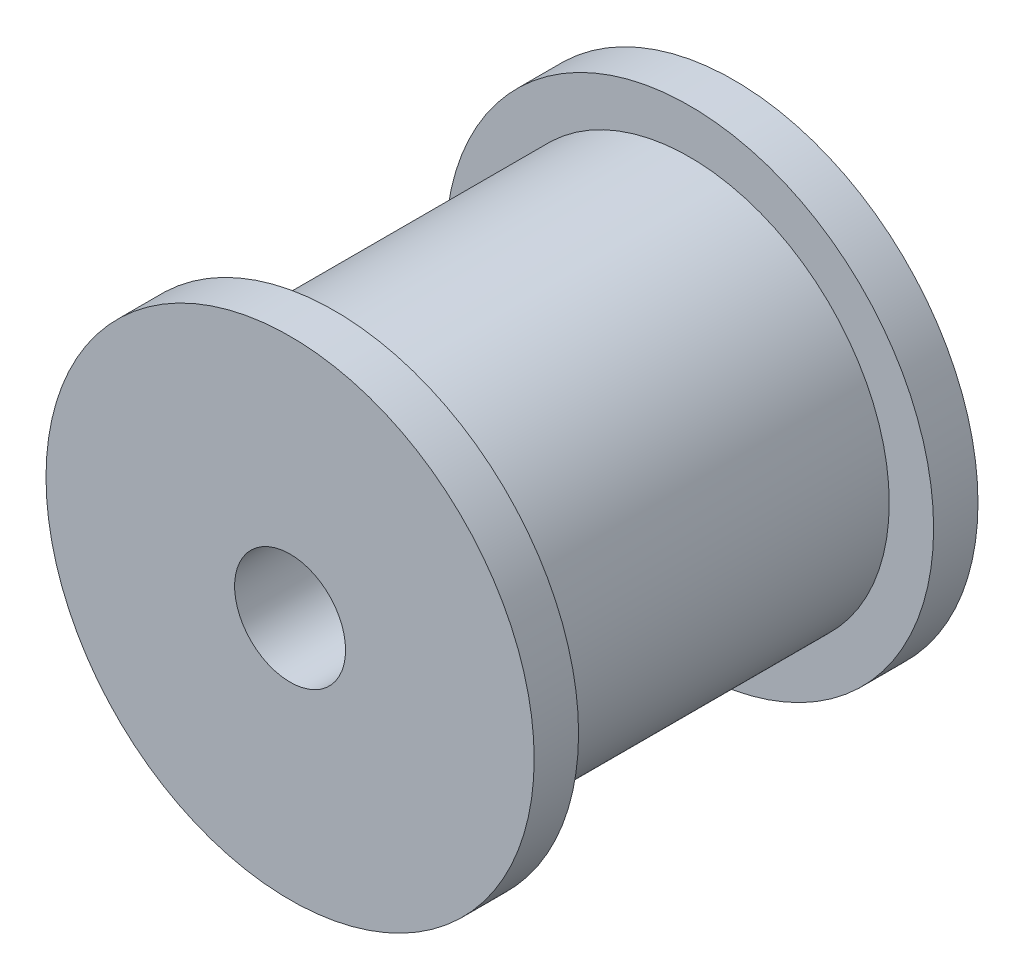
ISO-10303-21;
HEADER;
FILE_DESCRIPTION(('STEP AP214'),'2;1');
FILE_NAME('part.step','',(''),(''),'','','');
FILE_SCHEMA(('AUTOMOTIVE_DESIGN { 1 0 10303 214 1 1 1 1 }'));
ENDSEC;
DATA;
#1=APPLICATION_CONTEXT('core data for automotive mechanical design processes');
#2=APPLICATION_PROTOCOL_DEFINITION('international standard','automotive_design',2000,#1);
#3=PRODUCT_CONTEXT('',#1,'mechanical');
#4=PRODUCT('Part','Part','',(#3));
#5=PRODUCT_RELATED_PRODUCT_CATEGORY('part','',(#4));
#6=PRODUCT_DEFINITION_FORMATION('','',#4);
#7=PRODUCT_DEFINITION_CONTEXT('part definition',#1,'design');
#8=PRODUCT_DEFINITION('design','',#6,#7);
#9=PRODUCT_DEFINITION_SHAPE('','',#8);
#10=(LENGTH_UNIT() NAMED_UNIT(*) SI_UNIT(.MILLI.,.METRE.));
#11=(NAMED_UNIT(*) PLANE_ANGLE_UNIT() SI_UNIT($,.RADIAN.));
#12=(NAMED_UNIT(*) SI_UNIT($,.STERADIAN.) SOLID_ANGLE_UNIT());
#13=UNCERTAINTY_MEASURE_WITH_UNIT(LENGTH_MEASURE(1.E-05),#10,'distance_accuracy_value','');
#14=(GEOMETRIC_REPRESENTATION_CONTEXT(3) GLOBAL_UNCERTAINTY_ASSIGNED_CONTEXT((#13)) GLOBAL_UNIT_ASSIGNED_CONTEXT((#10,
#11,#12)) REPRESENTATION_CONTEXT('',''));
#15=CARTESIAN_POINT('',(0.,0.,0.));
#16=DIRECTION('',(0.,0.,1.));
#17=DIRECTION('',(1.,0.,0.));
#18=AXIS2_PLACEMENT_3D('',#15,#16,#17);
#19=CARTESIAN_POINT('',(0.,0.,2.));
#20=DIRECTION('',(0.,0.,-1.));
#21=DIRECTION('',(-1.,0.,0.));
#22=AXIS2_PLACEMENT_3D('',#19,#20,#21);
#23=CYLINDRICAL_SURFACE('',#22,11.);
#24=CARTESIAN_POINT('',(0.,0.,2.));
#25=DIRECTION('',(0.,0.,1.));
#26=DIRECTION('',(1.,0.,0.));
#27=AXIS2_PLACEMENT_3D('',#24,#25,#26);
#28=CIRCLE('',#27,11.);
#29=CARTESIAN_POINT('',(11.,0.,2.));
#30=VERTEX_POINT('',#29);
#31=EDGE_CURVE('E41',#30,#30,#28,.T.);
#32=ORIENTED_EDGE('',*,*,#31,.F.);
#33=EDGE_LOOP('',(#32));
#34=FACE_BOUND('',#33,.T.);
#35=CARTESIAN_POINT('',(0.,0.,0.));
#36=DIRECTION('',(0.,0.,1.));
#37=DIRECTION('',(1.,0.,0.));
#38=AXIS2_PLACEMENT_3D('',#35,#36,#37);
#39=CIRCLE('',#38,11.);
#40=CARTESIAN_POINT('',(11.,0.,0.));
#41=VERTEX_POINT('',#40);
#42=EDGE_CURVE('E37',#41,#41,#39,.T.);
#43=ORIENTED_EDGE('',*,*,#42,.T.);
#44=EDGE_LOOP('',(#43));
#45=FACE_BOUND('',#44,.T.);
#46=ADVANCED_FACE('F34',(#34,#45),#23,.T.);
#47=CARTESIAN_POINT('',(0.,0.,2.));
#48=DIRECTION('',(0.,0.,1.));
#49=DIRECTION('',(1.,0.,0.));
#50=AXIS2_PLACEMENT_3D('',#47,#48,#49);
#51=PLANE('',#50);
#52=CARTESIAN_POINT('',(0.,0.,2.));
#53=DIRECTION('',(0.,0.,1.));
#54=DIRECTION('',(1.,0.,0.));
#55=AXIS2_PLACEMENT_3D('',#52,#53,#54);
#56=CIRCLE('',#55,9.);
#57=CARTESIAN_POINT('',(9.,0.,2.));
#58=VERTEX_POINT('',#57);
#59=EDGE_CURVE('E10',#58,#58,#56,.T.);
#60=ORIENTED_EDGE('',*,*,#59,.F.);
#61=EDGE_LOOP('',(#60));
#62=FACE_BOUND('',#61,.T.);
#63=ORIENTED_EDGE('',*,*,#31,.T.);
#64=EDGE_LOOP('',(#63));
#65=FACE_BOUND('',#64,.T.);
#66=ADVANCED_FACE('F92',(#62,#65),#51,.T.);
#67=CARTESIAN_POINT('',(0.,0.,0.));
#68=DIRECTION('',(0.,0.,1.));
#69=DIRECTION('',(1.,0.,0.));
#70=AXIS2_PLACEMENT_3D('',#67,#68,#69);
#71=PLANE('',#70);
#72=CARTESIAN_POINT('',(0.,0.,0.));
#73=DIRECTION('',(0.,0.,1.));
#74=DIRECTION('',(1.,0.,0.));
#75=AXIS2_PLACEMENT_3D('',#72,#73,#74);
#76=CIRCLE('',#75,2.5);
#77=CARTESIAN_POINT('',(2.5,0.,0.));
#78=VERTEX_POINT('',#77);
#79=EDGE_CURVE('E54',#78,#78,#76,.T.);
#80=ORIENTED_EDGE('',*,*,#79,.T.);
#81=EDGE_LOOP('',(#80));
#82=FACE_BOUND('',#81,.T.);
#83=ORIENTED_EDGE('',*,*,#42,.F.);
#84=EDGE_LOOP('',(#83));
#85=FACE_BOUND('',#84,.T.);
#86=ADVANCED_FACE('F63',(#82,#85),#71,.F.);
#87=CARTESIAN_POINT('',(0.,0.,18.));
#88=DIRECTION('',(0.,0.,-1.));
#89=DIRECTION('',(-1.,0.,0.));
#90=AXIS2_PLACEMENT_3D('',#87,#88,#89);
#91=CYLINDRICAL_SURFACE('',#90,9.);
#92=CARTESIAN_POINT('',(0.,0.,18.));
#93=DIRECTION('',(0.,0.,1.));
#94=DIRECTION('',(1.,0.,0.));
#95=AXIS2_PLACEMENT_3D('',#92,#93,#94);
#96=CIRCLE('',#95,9.);
#97=CARTESIAN_POINT('',(9.,0.,18.));
#98=VERTEX_POINT('',#97);
#99=EDGE_CURVE('E47',#98,#98,#96,.T.);
#100=ORIENTED_EDGE('',*,*,#99,.F.);
#101=EDGE_LOOP('',(#100));
#102=FACE_BOUND('',#101,.T.);
#103=ORIENTED_EDGE('',*,*,#59,.T.);
#104=EDGE_LOOP('',(#103));
#105=FACE_BOUND('',#104,.T.);
#106=ADVANCED_FACE('F82',(#102,#105),#91,.T.);
#107=CARTESIAN_POINT('',(0.,0.,20.));
#108=DIRECTION('',(0.,0.,-1.));
#109=DIRECTION('',(-1.,0.,0.));
#110=AXIS2_PLACEMENT_3D('',#107,#108,#109);
#111=CYLINDRICAL_SURFACE('',#110,11.);
#112=CARTESIAN_POINT('',(0.,0.,20.));
#113=DIRECTION('',(0.,0.,1.));
#114=DIRECTION('',(1.,0.,0.));
#115=AXIS2_PLACEMENT_3D('',#112,#113,#114);
#116=CIRCLE('',#115,11.);
#117=CARTESIAN_POINT('',(11.,0.,20.));
#118=VERTEX_POINT('',#117);
#119=EDGE_CURVE('E50',#118,#118,#116,.T.);
#120=ORIENTED_EDGE('',*,*,#119,.F.);
#121=EDGE_LOOP('',(#120));
#122=FACE_BOUND('',#121,.T.);
#123=CARTESIAN_POINT('',(0.,0.,18.));
#124=DIRECTION('',(0.,0.,1.));
#125=DIRECTION('',(1.,0.,0.));
#126=AXIS2_PLACEMENT_3D('',#123,#124,#125);
#127=CIRCLE('',#126,11.);
#128=CARTESIAN_POINT('',(11.,0.,18.));
#129=VERTEX_POINT('',#128);
#130=EDGE_CURVE('E51',#129,#129,#127,.T.);
#131=ORIENTED_EDGE('',*,*,#130,.T.);
#132=EDGE_LOOP('',(#131));
#133=FACE_BOUND('',#132,.T.);
#134=ADVANCED_FACE('F76',(#122,#133),#111,.T.);
#135=CARTESIAN_POINT('',(0.,0.,20.));
#136=DIRECTION('',(0.,0.,1.));
#137=DIRECTION('',(1.,0.,0.));
#138=AXIS2_PLACEMENT_3D('',#135,#136,#137);
#139=PLANE('',#138);
#140=CARTESIAN_POINT('',(0.,0.,20.));
#141=DIRECTION('',(0.,0.,1.));
#142=DIRECTION('',(1.,0.,0.));
#143=AXIS2_PLACEMENT_3D('',#140,#141,#142);
#144=CIRCLE('',#143,2.5);
#145=CARTESIAN_POINT('',(2.5,0.,20.));
#146=VERTEX_POINT('',#145);
#147=EDGE_CURVE('E57',#146,#146,#144,.T.);
#148=ORIENTED_EDGE('',*,*,#147,.F.);
#149=EDGE_LOOP('',(#148));
#150=FACE_BOUND('',#149,.T.);
#151=ORIENTED_EDGE('',*,*,#119,.T.);
#152=EDGE_LOOP('',(#151));
#153=FACE_BOUND('',#152,.T.);
#154=ADVANCED_FACE('F73',(#150,#153),#139,.T.);
#155=CARTESIAN_POINT('',(0.,0.,18.));
#156=DIRECTION('',(0.,0.,1.));
#157=DIRECTION('',(1.,0.,0.));
#158=AXIS2_PLACEMENT_3D('',#155,#156,#157);
#159=PLANE('',#158);
#160=ORIENTED_EDGE('',*,*,#99,.T.);
#161=EDGE_LOOP('',(#160));
#162=FACE_BOUND('',#161,.T.);
#163=ORIENTED_EDGE('',*,*,#130,.F.);
#164=EDGE_LOOP('',(#163));
#165=FACE_BOUND('',#164,.T.);
#166=ADVANCED_FACE('F69',(#162,#165),#159,.F.);
#167=CARTESIAN_POINT('',(0.,0.,0.));
#168=DIRECTION('',(0.,0.,1.));
#169=DIRECTION('',(1.,0.,0.));
#170=AXIS2_PLACEMENT_3D('',#167,#168,#169);
#171=CYLINDRICAL_SURFACE('',#170,2.5);
#172=ORIENTED_EDGE('',*,*,#79,.F.);
#173=EDGE_LOOP('',(#172));
#174=FACE_BOUND('',#173,.T.);
#175=ORIENTED_EDGE('',*,*,#147,.T.);
#176=EDGE_LOOP('',(#175));
#177=FACE_BOUND('',#176,.T.);
#178=ADVANCED_FACE('F66',(#174,#177),#171,.F.);
#179=CLOSED_SHELL('',(#46,#66,#86,#106,#134,#154,#166,#178));
#180=MANIFOLD_SOLID_BREP('B2',#179);
#181=ADVANCED_BREP_SHAPE_REPRESENTATION('',(#18,#180),#14);
#182=SHAPE_DEFINITION_REPRESENTATION(#9,#181);
ENDSEC;
END-ISO-10303-21;
